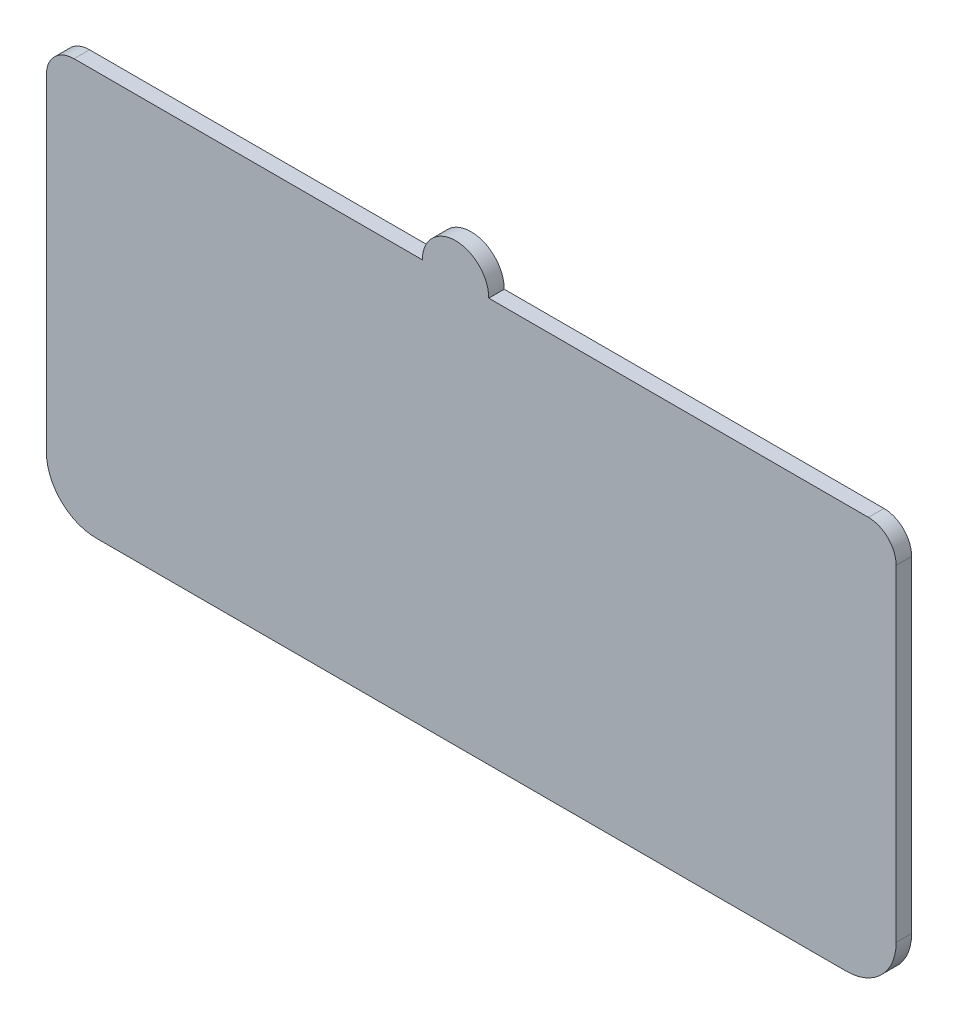
ISO-10303-21;
HEADER;
FILE_DESCRIPTION(('STEP AP214'),'2;1');
FILE_NAME('part.step','',(''),(''),'','','');
FILE_SCHEMA(('AUTOMOTIVE_DESIGN { 1 0 10303 214 1 1 1 1 }'));
ENDSEC;
DATA;
#1=APPLICATION_CONTEXT('core data for automotive mechanical design processes');
#2=APPLICATION_PROTOCOL_DEFINITION('international standard','automotive_design',2000,#1);
#3=PRODUCT_CONTEXT('',#1,'mechanical');
#4=PRODUCT('Part','Part','',(#3));
#5=PRODUCT_RELATED_PRODUCT_CATEGORY('part','',(#4));
#6=PRODUCT_DEFINITION_FORMATION('','',#4);
#7=PRODUCT_DEFINITION_CONTEXT('part definition',#1,'design');
#8=PRODUCT_DEFINITION('design','',#6,#7);
#9=PRODUCT_DEFINITION_SHAPE('','',#8);
#10=(LENGTH_UNIT() NAMED_UNIT(*) SI_UNIT(.MILLI.,.METRE.));
#11=(NAMED_UNIT(*) PLANE_ANGLE_UNIT() SI_UNIT($,.RADIAN.));
#12=(NAMED_UNIT(*) SI_UNIT($,.STERADIAN.) SOLID_ANGLE_UNIT());
#13=UNCERTAINTY_MEASURE_WITH_UNIT(LENGTH_MEASURE(1.E-05),#10,'distance_accuracy_value','');
#14=(GEOMETRIC_REPRESENTATION_CONTEXT(3) GLOBAL_UNCERTAINTY_ASSIGNED_CONTEXT((#13)) GLOBAL_UNIT_ASSIGNED_CONTEXT((#10,
#11,#12)) REPRESENTATION_CONTEXT('',''));
#15=CARTESIAN_POINT('',(0.,0.,0.));
#16=DIRECTION('',(0.,0.,1.));
#17=DIRECTION('',(1.,0.,0.));
#18=AXIS2_PLACEMENT_3D('',#15,#16,#17);
#19=CARTESIAN_POINT('',(76.75,36.5,2.8));
#20=DIRECTION('',(-1.,0.,0.));
#21=DIRECTION('',(0.,-1.,0.));
#22=AXIS2_PLACEMENT_3D('',#19,#20,#21);
#23=PLANE('',#22);
#24=DIRECTION('',(0.,1.,0.));
#25=VECTOR('',#24,1.);
#26=CARTESIAN_POINT('',(76.75,36.5,0.));
#27=LINE('',#26,#25);
#28=CARTESIAN_POINT('',(76.75,-27.5,0.));
#29=VERTEX_POINT('',#28);
#30=CARTESIAN_POINT('',(76.75,31.5,0.));
#31=VERTEX_POINT('',#30);
#32=EDGE_CURVE('E159',#29,#31,#27,.T.);
#33=ORIENTED_EDGE('',*,*,#32,.T.);
#34=DIRECTION('',(0.,0.,-1.));
#35=VECTOR('',#34,1.);
#36=CARTESIAN_POINT('',(76.75,31.5,2.8));
#37=LINE('',#36,#35);
#38=CARTESIAN_POINT('',(76.75,31.5,2.8));
#39=VERTEX_POINT('',#38);
#40=EDGE_CURVE('E11',#31,#39,#37,.F.);
#41=ORIENTED_EDGE('',*,*,#40,.T.);
#42=DIRECTION('',(0.,1.,0.));
#43=VECTOR('',#42,1.);
#44=CARTESIAN_POINT('',(76.75,36.5,2.8));
#45=LINE('',#44,#43);
#46=CARTESIAN_POINT('',(76.75,-27.5,2.8));
#47=VERTEX_POINT('',#46);
#48=EDGE_CURVE('E129',#47,#39,#45,.T.);
#49=ORIENTED_EDGE('',*,*,#48,.F.);
#50=DIRECTION('',(0.,0.,-1.));
#51=VECTOR('',#50,1.);
#52=CARTESIAN_POINT('',(76.75,-27.5,2.8));
#53=LINE('',#52,#51);
#54=EDGE_CURVE('E139',#47,#29,#53,.T.);
#55=ORIENTED_EDGE('',*,*,#54,.T.);
#56=EDGE_LOOP('',(#33,#41,#49,#55));
#57=FACE_BOUND('',#56,.T.);
#58=ADVANCED_FACE('F43',(#57),#23,.F.);
#59=CARTESIAN_POINT('',(3.16334856216216,36.5,2.8));
#60=DIRECTION('',(0.,-1.,0.));
#61=DIRECTION('',(1.,0.,0.));
#62=AXIS2_PLACEMENT_3D('',#59,#60,#61);
#63=PLANE('',#62);
#64=DIRECTION('',(-1.,0.,0.));
#65=VECTOR('',#64,1.);
#66=CARTESIAN_POINT('',(3.16334856216216,36.5,2.8));
#67=LINE('',#66,#65);
#68=CARTESIAN_POINT('',(71.75,36.5,2.8));
#69=VERTEX_POINT('',#68);
#70=CARTESIAN_POINT('',(3.16334856216216,36.5,2.8));
#71=VERTEX_POINT('',#70);
#72=EDGE_CURVE('E118',#69,#71,#67,.T.);
#73=ORIENTED_EDGE('',*,*,#72,.F.);
#74=DIRECTION('',(0.,0.,-1.));
#75=VECTOR('',#74,1.);
#76=CARTESIAN_POINT('',(71.75,36.5,2.8));
#77=LINE('',#76,#75);
#78=CARTESIAN_POINT('',(71.75,36.5,0.));
#79=VERTEX_POINT('',#78);
#80=EDGE_CURVE('E52',#69,#79,#77,.T.);
#81=ORIENTED_EDGE('',*,*,#80,.T.);
#82=DIRECTION('',(-1.,0.,0.));
#83=VECTOR('',#82,1.);
#84=CARTESIAN_POINT('',(3.16334856216216,36.5,0.));
#85=LINE('',#84,#83);
#86=CARTESIAN_POINT('',(3.16334856216216,36.5,0.));
#87=VERTEX_POINT('',#86);
#88=EDGE_CURVE('E135',#79,#87,#85,.T.);
#89=ORIENTED_EDGE('',*,*,#88,.T.);
#90=DIRECTION('',(0.,0.,-1.));
#91=VECTOR('',#90,1.);
#92=CARTESIAN_POINT('',(3.16334856216216,36.5,2.8));
#93=LINE('',#92,#91);
#94=EDGE_CURVE('E132',#71,#87,#93,.T.);
#95=ORIENTED_EDGE('',*,*,#94,.F.);
#96=EDGE_LOOP('',(#73,#81,#89,#95));
#97=FACE_BOUND('',#96,.T.);
#98=ADVANCED_FACE('F133',(#97),#63,.F.);
#99=CARTESIAN_POINT('',(-2.83665143783784,36.5,2.8));
#100=DIRECTION('',(0.,0.,-1.));
#101=DIRECTION('',(-1.,0.,0.));
#102=AXIS2_PLACEMENT_3D('',#99,#100,#101);
#103=CYLINDRICAL_SURFACE('',#102,6.);
#104=CARTESIAN_POINT('',(-2.83665143783784,36.5,0.));
#105=DIRECTION('',(0.,0.,1.));
#106=DIRECTION('',(1.,0.,0.));
#107=AXIS2_PLACEMENT_3D('',#104,#105,#106);
#108=CIRCLE('',#107,6.);
#109=CARTESIAN_POINT('',(-8.83665143783784,36.5,0.));
#110=VERTEX_POINT('',#109);
#111=EDGE_CURVE('E164',#87,#110,#108,.T.);
#112=ORIENTED_EDGE('',*,*,#111,.T.);
#113=DIRECTION('',(0.,0.,-1.));
#114=VECTOR('',#113,1.);
#115=CARTESIAN_POINT('',(-8.83665143783784,36.5,2.8));
#116=LINE('',#115,#114);
#117=CARTESIAN_POINT('',(-8.83665143783784,36.5,2.8));
#118=VERTEX_POINT('',#117);
#119=EDGE_CURVE('E140',#118,#110,#116,.T.);
#120=ORIENTED_EDGE('',*,*,#119,.F.);
#121=CARTESIAN_POINT('',(-2.83665143783784,36.5,2.8));
#122=DIRECTION('',(0.,0.,1.));
#123=DIRECTION('',(1.,0.,0.));
#124=AXIS2_PLACEMENT_3D('',#121,#122,#123);
#125=CIRCLE('',#124,6.);
#126=EDGE_CURVE('E123',#71,#118,#125,.T.);
#127=ORIENTED_EDGE('',*,*,#126,.F.);
#128=ORIENTED_EDGE('',*,*,#94,.T.);
#129=EDGE_LOOP('',(#112,#120,#127,#128));
#130=FACE_BOUND('',#129,.T.);
#131=ADVANCED_FACE('F142',(#130),#103,.T.);
#132=CARTESIAN_POINT('',(-76.75,36.5,2.8));
#133=DIRECTION('',(0.,-1.,0.));
#134=DIRECTION('',(0.,0.,-1.));
#135=AXIS2_PLACEMENT_3D('',#132,#133,#134);
#136=PLANE('',#135);
#137=DIRECTION('',(-1.,0.,0.));
#138=VECTOR('',#137,1.);
#139=CARTESIAN_POINT('',(-76.75,36.5,0.));
#140=LINE('',#139,#138);
#141=CARTESIAN_POINT('',(-71.75,36.5,0.));
#142=VERTEX_POINT('',#141);
#143=EDGE_CURVE('E167',#110,#142,#140,.T.);
#144=ORIENTED_EDGE('',*,*,#143,.T.);
#145=DIRECTION('',(0.,0.,-1.));
#146=VECTOR('',#145,1.);
#147=CARTESIAN_POINT('',(-71.75,36.5,2.8));
#148=LINE('',#147,#146);
#149=CARTESIAN_POINT('',(-71.75,36.5,2.8));
#150=VERTEX_POINT('',#149);
#151=EDGE_CURVE('E217',#142,#150,#148,.F.);
#152=ORIENTED_EDGE('',*,*,#151,.T.);
#153=DIRECTION('',(-1.,0.,0.));
#154=VECTOR('',#153,1.);
#155=CARTESIAN_POINT('',(-76.75,36.5,2.8));
#156=LINE('',#155,#154);
#157=EDGE_CURVE('E146',#118,#150,#156,.T.);
#158=ORIENTED_EDGE('',*,*,#157,.F.);
#159=ORIENTED_EDGE('',*,*,#119,.T.);
#160=EDGE_LOOP('',(#144,#152,#158,#159));
#161=FACE_BOUND('',#160,.T.);
#162=ADVANCED_FACE('F232',(#161),#136,.F.);
#163=CARTESIAN_POINT('',(-76.75,36.5,2.8));
#164=DIRECTION('',(1.,0.,0.));
#165=DIRECTION('',(0.,1.,0.));
#166=AXIS2_PLACEMENT_3D('',#163,#164,#165);
#167=PLANE('',#166);
#168=DIRECTION('',(0.,-1.,0.));
#169=VECTOR('',#168,1.);
#170=CARTESIAN_POINT('',(-76.75,36.5,2.8));
#171=LINE('',#170,#169);
#172=CARTESIAN_POINT('',(-76.75,31.5,2.8));
#173=VERTEX_POINT('',#172);
#174=CARTESIAN_POINT('',(-76.75,-27.5,2.8));
#175=VERTEX_POINT('',#174);
#176=EDGE_CURVE('E149',#173,#175,#171,.T.);
#177=ORIENTED_EDGE('',*,*,#176,.F.);
#178=DIRECTION('',(0.,0.,-1.));
#179=VECTOR('',#178,1.);
#180=CARTESIAN_POINT('',(-76.75,31.5,2.8));
#181=LINE('',#180,#179);
#182=CARTESIAN_POINT('',(-76.75,31.5,0.));
#183=VERTEX_POINT('',#182);
#184=EDGE_CURVE('E207',#173,#183,#181,.T.);
#185=ORIENTED_EDGE('',*,*,#184,.T.);
#186=DIRECTION('',(0.,-1.,0.));
#187=VECTOR('',#186,1.);
#188=CARTESIAN_POINT('',(-76.75,36.5,0.));
#189=LINE('',#188,#187);
#190=CARTESIAN_POINT('',(-76.75,-27.5,0.));
#191=VERTEX_POINT('',#190);
#192=EDGE_CURVE('E171',#183,#191,#189,.T.);
#193=ORIENTED_EDGE('',*,*,#192,.T.);
#194=DIRECTION('',(0.,0.,-1.));
#195=VECTOR('',#194,1.);
#196=CARTESIAN_POINT('',(-76.75,-27.5,2.8));
#197=LINE('',#196,#195);
#198=EDGE_CURVE('E203',#191,#175,#197,.F.);
#199=ORIENTED_EDGE('',*,*,#198,.T.);
#200=EDGE_LOOP('',(#177,#185,#193,#199));
#201=FACE_BOUND('',#200,.T.);
#202=ADVANCED_FACE('F240',(#201),#167,.F.);
#203=CARTESIAN_POINT('',(-76.75,-36.5,2.8));
#204=DIRECTION('',(0.,1.,0.));
#205=DIRECTION('',(0.,0.,1.));
#206=AXIS2_PLACEMENT_3D('',#203,#204,#205);
#207=PLANE('',#206);
#208=DIRECTION('',(1.,0.,0.));
#209=VECTOR('',#208,1.);
#210=CARTESIAN_POINT('',(-76.75,-36.5,0.));
#211=LINE('',#210,#209);
#212=CARTESIAN_POINT('',(-67.75,-36.5,0.));
#213=VERTEX_POINT('',#212);
#214=CARTESIAN_POINT('',(67.75,-36.5,0.));
#215=VERTEX_POINT('',#214);
#216=EDGE_CURVE('E174',#213,#215,#211,.T.);
#217=ORIENTED_EDGE('',*,*,#216,.T.);
#218=DIRECTION('',(0.,0.,-1.));
#219=VECTOR('',#218,1.);
#220=CARTESIAN_POINT('',(67.75,-36.5,2.8));
#221=LINE('',#220,#219);
#222=CARTESIAN_POINT('',(67.75,-36.5,2.8));
#223=VERTEX_POINT('',#222);
#224=EDGE_CURVE('E194',#215,#223,#221,.F.);
#225=ORIENTED_EDGE('',*,*,#224,.T.);
#226=DIRECTION('',(1.,0.,0.));
#227=VECTOR('',#226,1.);
#228=CARTESIAN_POINT('',(-76.75,-36.5,2.8));
#229=LINE('',#228,#227);
#230=CARTESIAN_POINT('',(-67.75,-36.5,2.8));
#231=VERTEX_POINT('',#230);
#232=EDGE_CURVE('E155',#231,#223,#229,.T.);
#233=ORIENTED_EDGE('',*,*,#232,.F.);
#234=DIRECTION('',(0.,0.,-1.));
#235=VECTOR('',#234,1.);
#236=CARTESIAN_POINT('',(-67.75,-36.5,2.8));
#237=LINE('',#236,#235);
#238=EDGE_CURVE('E190',#231,#213,#237,.T.);
#239=ORIENTED_EDGE('',*,*,#238,.T.);
#240=EDGE_LOOP('',(#217,#225,#233,#239));
#241=FACE_BOUND('',#240,.T.);
#242=ADVANCED_FACE('F250',(#241),#207,.F.);
#243=CARTESIAN_POINT('',(-2.83665143783784,36.5,2.8));
#244=DIRECTION('',(0.,0.,1.));
#245=DIRECTION('',(1.,0.,0.));
#246=AXIS2_PLACEMENT_3D('',#243,#244,#245);
#247=PLANE('',#246);
#248=ORIENTED_EDGE('',*,*,#157,.T.);
#249=CARTESIAN_POINT('',(-71.75,31.5,2.8));
#250=DIRECTION('',(0.,0.,1.));
#251=DIRECTION('',(1.,0.,0.));
#252=AXIS2_PLACEMENT_3D('',#249,#250,#251);
#253=CIRCLE('',#252,5.);
#254=EDGE_CURVE('E222',#150,#173,#253,.T.);
#255=ORIENTED_EDGE('',*,*,#254,.T.);
#256=ORIENTED_EDGE('',*,*,#176,.T.);
#257=CARTESIAN_POINT('',(-67.75,-27.5,2.8));
#258=DIRECTION('',(0.,0.,1.));
#259=DIRECTION('',(1.,0.,0.));
#260=AXIS2_PLACEMENT_3D('',#257,#258,#259);
#261=CIRCLE('',#260,9.);
#262=EDGE_CURVE('E197',#175,#231,#261,.T.);
#263=ORIENTED_EDGE('',*,*,#262,.T.);
#264=ORIENTED_EDGE('',*,*,#232,.T.);
#265=CARTESIAN_POINT('',(67.75,-27.5,2.8));
#266=DIRECTION('',(0.,0.,1.));
#267=DIRECTION('',(1.,0.,0.));
#268=AXIS2_PLACEMENT_3D('',#265,#266,#267);
#269=CIRCLE('',#268,9.);
#270=EDGE_CURVE('E200',#223,#47,#269,.T.);
#271=ORIENTED_EDGE('',*,*,#270,.T.);
#272=ORIENTED_EDGE('',*,*,#48,.T.);
#273=CARTESIAN_POINT('',(71.75,31.5,2.8));
#274=DIRECTION('',(0.,0.,1.));
#275=DIRECTION('',(1.,0.,0.));
#276=AXIS2_PLACEMENT_3D('',#273,#274,#275);
#277=CIRCLE('',#276,5.);
#278=EDGE_CURVE('E59',#39,#69,#277,.T.);
#279=ORIENTED_EDGE('',*,*,#278,.T.);
#280=ORIENTED_EDGE('',*,*,#72,.T.);
#281=ORIENTED_EDGE('',*,*,#126,.T.);
#282=EDGE_LOOP('',(#248,#255,#256,#263,#264,#271,#272,#279,#280,#281));
#283=FACE_BOUND('',#282,.T.);
#284=ADVANCED_FACE('F121',(#283),#247,.T.);
#285=CARTESIAN_POINT('',(-2.83665143783784,36.5,0.));
#286=DIRECTION('',(0.,0.,1.));
#287=DIRECTION('',(1.,0.,0.));
#288=AXIS2_PLACEMENT_3D('',#285,#286,#287);
#289=PLANE('',#288);
#290=ORIENTED_EDGE('',*,*,#192,.F.);
#291=CARTESIAN_POINT('',(-71.75,31.5,0.));
#292=DIRECTION('',(0.,0.,1.));
#293=DIRECTION('',(1.,0.,0.));
#294=AXIS2_PLACEMENT_3D('',#291,#292,#293);
#295=CIRCLE('',#294,5.);
#296=EDGE_CURVE('E214',#183,#142,#295,.F.);
#297=ORIENTED_EDGE('',*,*,#296,.T.);
#298=ORIENTED_EDGE('',*,*,#143,.F.);
#299=ORIENTED_EDGE('',*,*,#111,.F.);
#300=ORIENTED_EDGE('',*,*,#88,.F.);
#301=CARTESIAN_POINT('',(71.75,31.5,0.));
#302=DIRECTION('',(0.,0.,1.));
#303=DIRECTION('',(1.,0.,0.));
#304=AXIS2_PLACEMENT_3D('',#301,#302,#303);
#305=CIRCLE('',#304,5.);
#306=EDGE_CURVE('E211',#79,#31,#305,.F.);
#307=ORIENTED_EDGE('',*,*,#306,.T.);
#308=ORIENTED_EDGE('',*,*,#32,.F.);
#309=CARTESIAN_POINT('',(67.75,-27.5,0.));
#310=DIRECTION('',(0.,0.,1.));
#311=DIRECTION('',(1.,0.,0.));
#312=AXIS2_PLACEMENT_3D('',#309,#310,#311);
#313=CIRCLE('',#312,9.);
#314=EDGE_CURVE('E187',#29,#215,#313,.F.);
#315=ORIENTED_EDGE('',*,*,#314,.T.);
#316=ORIENTED_EDGE('',*,*,#216,.F.);
#317=CARTESIAN_POINT('',(-67.75,-27.5,0.));
#318=DIRECTION('',(0.,0.,1.));
#319=DIRECTION('',(1.,0.,0.));
#320=AXIS2_PLACEMENT_3D('',#317,#318,#319);
#321=CIRCLE('',#320,9.);
#322=EDGE_CURVE('E183',#213,#191,#321,.F.);
#323=ORIENTED_EDGE('',*,*,#322,.T.);
#324=EDGE_LOOP('',(#290,#297,#298,#299,#300,#307,#308,#315,#316,#323));
#325=FACE_BOUND('',#324,.T.);
#326=ADVANCED_FACE('F228',(#325),#289,.F.);
#327=CARTESIAN_POINT('',(67.75,-27.5,2.8));
#328=DIRECTION('',(0.,0.,-1.));
#329=DIRECTION('',(-1.,0.,0.));
#330=AXIS2_PLACEMENT_3D('',#327,#328,#329);
#331=CYLINDRICAL_SURFACE('',#330,9.);
#332=ORIENTED_EDGE('',*,*,#270,.F.);
#333=ORIENTED_EDGE('',*,*,#224,.F.);
#334=ORIENTED_EDGE('',*,*,#314,.F.);
#335=ORIENTED_EDGE('',*,*,#54,.F.);
#336=EDGE_LOOP('',(#332,#333,#334,#335));
#337=FACE_BOUND('',#336,.T.);
#338=ADVANCED_FACE('F253',(#337),#331,.T.);
#339=CARTESIAN_POINT('',(-67.75,-27.5,2.8));
#340=DIRECTION('',(0.,0.,-1.));
#341=DIRECTION('',(-1.,0.,0.));
#342=AXIS2_PLACEMENT_3D('',#339,#340,#341);
#343=CYLINDRICAL_SURFACE('',#342,9.);
#344=ORIENTED_EDGE('',*,*,#262,.F.);
#345=ORIENTED_EDGE('',*,*,#198,.F.);
#346=ORIENTED_EDGE('',*,*,#322,.F.);
#347=ORIENTED_EDGE('',*,*,#238,.F.);
#348=EDGE_LOOP('',(#344,#345,#346,#347));
#349=FACE_BOUND('',#348,.T.);
#350=ADVANCED_FACE('F246',(#349),#343,.T.);
#351=CARTESIAN_POINT('',(-71.75,31.5,2.8));
#352=DIRECTION('',(0.,0.,-1.));
#353=DIRECTION('',(-1.,0.,0.));
#354=AXIS2_PLACEMENT_3D('',#351,#352,#353);
#355=CYLINDRICAL_SURFACE('',#354,5.);
#356=ORIENTED_EDGE('',*,*,#254,.F.);
#357=ORIENTED_EDGE('',*,*,#151,.F.);
#358=ORIENTED_EDGE('',*,*,#296,.F.);
#359=ORIENTED_EDGE('',*,*,#184,.F.);
#360=EDGE_LOOP('',(#356,#357,#358,#359));
#361=FACE_BOUND('',#360,.T.);
#362=ADVANCED_FACE('F238',(#361),#355,.T.);
#363=CARTESIAN_POINT('',(71.75,31.5,2.8));
#364=DIRECTION('',(0.,0.,-1.));
#365=DIRECTION('',(-1.,0.,0.));
#366=AXIS2_PLACEMENT_3D('',#363,#364,#365);
#367=CYLINDRICAL_SURFACE('',#366,5.);
#368=ORIENTED_EDGE('',*,*,#278,.F.);
#369=ORIENTED_EDGE('',*,*,#40,.F.);
#370=ORIENTED_EDGE('',*,*,#306,.F.);
#371=ORIENTED_EDGE('',*,*,#80,.F.);
#372=EDGE_LOOP('',(#368,#369,#370,#371));
#373=FACE_BOUND('',#372,.T.);
#374=ADVANCED_FACE('F45',(#373),#367,.T.);
#375=CLOSED_SHELL('',(#58,#98,#131,#162,#202,#242,#284,#326,#338,#350,#362,#374));
#376=MANIFOLD_SOLID_BREP('B2',#375);
#377=ADVANCED_BREP_SHAPE_REPRESENTATION('',(#18,#376),#14);
#378=SHAPE_DEFINITION_REPRESENTATION(#9,#377);
ENDSEC;
END-ISO-10303-21;
